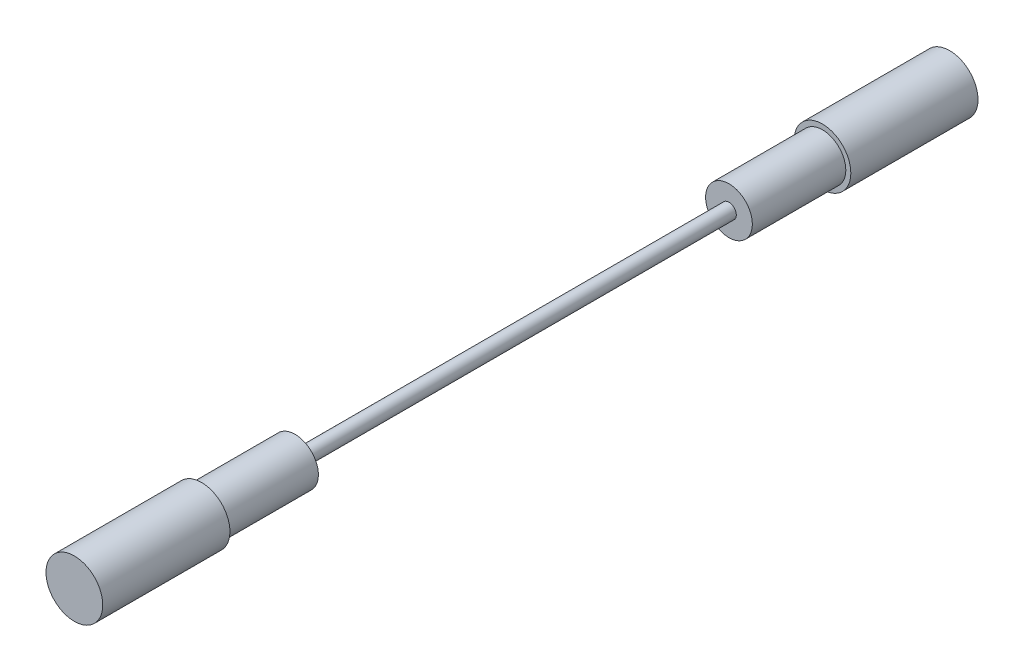
ISO-10303-21;
HEADER;
FILE_DESCRIPTION(('STEP AP214'),'2;1');
FILE_NAME('part.step','',(''),(''),'','','');
FILE_SCHEMA(('AUTOMOTIVE_DESIGN { 1 0 10303 214 1 1 1 1 }'));
ENDSEC;
DATA;
#1=APPLICATION_CONTEXT('core data for automotive mechanical design processes');
#2=APPLICATION_PROTOCOL_DEFINITION('international standard','automotive_design',2000,#1);
#3=PRODUCT_CONTEXT('',#1,'mechanical');
#4=PRODUCT('Part','Part','',(#3));
#5=PRODUCT_RELATED_PRODUCT_CATEGORY('part','',(#4));
#6=PRODUCT_DEFINITION_FORMATION('','',#4);
#7=PRODUCT_DEFINITION_CONTEXT('part definition',#1,'design');
#8=PRODUCT_DEFINITION('design','',#6,#7);
#9=PRODUCT_DEFINITION_SHAPE('','',#8);
#10=(LENGTH_UNIT() NAMED_UNIT(*) SI_UNIT(.MILLI.,.METRE.));
#11=(NAMED_UNIT(*) PLANE_ANGLE_UNIT() SI_UNIT($,.RADIAN.));
#12=(NAMED_UNIT(*) SI_UNIT($,.STERADIAN.) SOLID_ANGLE_UNIT());
#13=UNCERTAINTY_MEASURE_WITH_UNIT(LENGTH_MEASURE(1.E-05),#10,'distance_accuracy_value','');
#14=(GEOMETRIC_REPRESENTATION_CONTEXT(3) GLOBAL_UNCERTAINTY_ASSIGNED_CONTEXT((#13)) GLOBAL_UNIT_ASSIGNED_CONTEXT((#10,
#11,#12)) REPRESENTATION_CONTEXT('',''));
#15=CARTESIAN_POINT('',(0.,0.,0.));
#16=DIRECTION('',(0.,0.,1.));
#17=DIRECTION('',(1.,0.,0.));
#18=AXIS2_PLACEMENT_3D('',#15,#16,#17);
#19=CARTESIAN_POINT('',(149.433579659607,0.,306.2));
#20=DIRECTION('',(0.,0.,-1.));
#21=DIRECTION('',(0.,1.,0.));
#22=AXIS2_PLACEMENT_3D('',#19,#20,#21);
#23=PLANE('',#22);
#24=CARTESIAN_POINT('',(140.996079659607,0.,306.2));
#25=DIRECTION('',(0.,0.,-1.));
#26=DIRECTION('',(0.,1.,0.));
#27=AXIS2_PLACEMENT_3D('',#24,#25,#26);
#28=CIRCLE('',#27,8.5);
#29=CARTESIAN_POINT('',(140.996079659607,8.5,306.2));
#30=VERTEX_POINT('',#29);
#31=EDGE_CURVE('E18',#30,#30,#28,.T.);
#32=ORIENTED_EDGE('',*,*,#31,.F.);
#33=EDGE_LOOP('',(#32));
#34=FACE_BOUND('',#33,.T.);
#35=ADVANCED_FACE('F15',(#34),#23,.F.);
#36=CARTESIAN_POINT('',(140.996079659607,0.,306.2));
#37=DIRECTION('',(0.,0.,-1.));
#38=DIRECTION('',(0.,1.,0.));
#39=AXIS2_PLACEMENT_3D('',#36,#37,#38);
#40=CYLINDRICAL_SURFACE('',#39,8.5);
#41=ORIENTED_EDGE('',*,*,#31,.T.);
#42=EDGE_LOOP('',(#41));
#43=FACE_BOUND('',#42,.T.);
#44=CARTESIAN_POINT('',(140.996079659607,0.,268.1));
#45=DIRECTION('',(0.,0.,-1.));
#46=DIRECTION('',(0.,1.,0.));
#47=AXIS2_PLACEMENT_3D('',#44,#45,#46);
#48=CIRCLE('',#47,8.5);
#49=CARTESIAN_POINT('',(140.996079659607,8.49999999999999,268.1));
#50=VERTEX_POINT('',#49);
#51=EDGE_CURVE('E46',#50,#50,#48,.T.);
#52=ORIENTED_EDGE('',*,*,#51,.F.);
#53=EDGE_LOOP('',(#52));
#54=FACE_BOUND('',#53,.T.);
#55=ADVANCED_FACE('F53',(#43,#54),#40,.T.);
#56=CARTESIAN_POINT('',(149.433579659607,0.,268.1));
#57=DIRECTION('',(0.,0.,-1.));
#58=DIRECTION('',(0.,1.,0.));
#59=AXIS2_PLACEMENT_3D('',#56,#57,#58);
#60=PLANE('',#59);
#61=ORIENTED_EDGE('',*,*,#51,.T.);
#62=EDGE_LOOP('',(#61));
#63=FACE_BOUND('',#62,.T.);
#64=CARTESIAN_POINT('',(140.996079659607,0.,268.1));
#65=DIRECTION('',(0.,0.,-1.));
#66=DIRECTION('',(0.,1.,0.));
#67=AXIS2_PLACEMENT_3D('',#64,#65,#66);
#68=CIRCLE('',#67,7.);
#69=CARTESIAN_POINT('',(140.996079659607,6.99999999999999,268.1));
#70=VERTEX_POINT('',#69);
#71=EDGE_CURVE('E44',#70,#70,#68,.T.);
#72=ORIENTED_EDGE('',*,*,#71,.F.);
#73=EDGE_LOOP('',(#72));
#74=FACE_BOUND('',#73,.T.);
#75=ADVANCED_FACE('F61',(#63,#74),#60,.T.);
#76=CARTESIAN_POINT('',(140.996079659607,0.,268.1));
#77=DIRECTION('',(0.,0.,-1.));
#78=DIRECTION('',(0.,1.,0.));
#79=AXIS2_PLACEMENT_3D('',#76,#77,#78);
#80=CYLINDRICAL_SURFACE('',#79,7.);
#81=ORIENTED_EDGE('',*,*,#71,.T.);
#82=EDGE_LOOP('',(#81));
#83=FACE_BOUND('',#82,.T.);
#84=CARTESIAN_POINT('',(140.996079659607,0.,240.1));
#85=DIRECTION('',(0.,0.,-1.));
#86=DIRECTION('',(0.,1.,0.));
#87=AXIS2_PLACEMENT_3D('',#84,#85,#86);
#88=CIRCLE('',#87,7.);
#89=CARTESIAN_POINT('',(140.996079659607,6.99999999999998,240.1));
#90=VERTEX_POINT('',#89);
#91=EDGE_CURVE('E41',#90,#90,#88,.T.);
#92=ORIENTED_EDGE('',*,*,#91,.F.);
#93=EDGE_LOOP('',(#92));
#94=FACE_BOUND('',#93,.T.);
#95=ADVANCED_FACE('F92',(#83,#94),#80,.T.);
#96=CARTESIAN_POINT('',(140.996079659607,0.,240.1));
#97=DIRECTION('',(0.,0.,-1.));
#98=DIRECTION('',(0.,1.,0.));
#99=AXIS2_PLACEMENT_3D('',#96,#97,#98);
#100=PLANE('',#99);
#101=CARTESIAN_POINT('',(140.996079659607,0.,240.1));
#102=DIRECTION('',(0.,0.,1.));
#103=DIRECTION('',(1.,0.,0.));
#104=AXIS2_PLACEMENT_3D('',#101,#102,#103);
#105=CIRCLE('',#104,2.2);
#106=CARTESIAN_POINT('',(143.196079659607,0.,240.1));
#107=VERTEX_POINT('',#106);
#108=EDGE_CURVE('E38',#107,#107,#105,.F.);
#109=ORIENTED_EDGE('',*,*,#108,.F.);
#110=EDGE_LOOP('',(#109));
#111=FACE_BOUND('',#110,.T.);
#112=ORIENTED_EDGE('',*,*,#91,.T.);
#113=EDGE_LOOP('',(#112));
#114=FACE_BOUND('',#113,.T.);
#115=ADVANCED_FACE('F88',(#111,#114),#100,.T.);
#116=CARTESIAN_POINT('',(140.996079659607,0.,110.1));
#117=DIRECTION('',(0.,0.,1.));
#118=DIRECTION('',(1.,0.,0.));
#119=AXIS2_PLACEMENT_3D('',#116,#117,#118);
#120=CYLINDRICAL_SURFACE('',#119,2.2);
#121=CARTESIAN_POINT('',(140.996079659607,0.,110.1));
#122=DIRECTION('',(0.,0.,1.));
#123=DIRECTION('',(1.,0.,0.));
#124=AXIS2_PLACEMENT_3D('',#121,#122,#123);
#125=CIRCLE('',#124,2.2);
#126=CARTESIAN_POINT('',(143.196079659607,0.,110.1));
#127=VERTEX_POINT('',#126);
#128=EDGE_CURVE('E35',#127,#127,#125,.F.);
#129=ORIENTED_EDGE('',*,*,#128,.F.);
#130=EDGE_LOOP('',(#129));
#131=FACE_BOUND('',#130,.T.);
#132=ORIENTED_EDGE('',*,*,#108,.T.);
#133=EDGE_LOOP('',(#132));
#134=FACE_BOUND('',#133,.T.);
#135=ADVANCED_FACE('F84',(#131,#134),#120,.T.);
#136=CARTESIAN_POINT('',(140.996079659607,0.,110.1));
#137=DIRECTION('',(0.,0.,1.));
#138=DIRECTION('',(1.,0.,0.));
#139=AXIS2_PLACEMENT_3D('',#136,#137,#138);
#140=PLANE('',#139);
#141=ORIENTED_EDGE('',*,*,#128,.T.);
#142=EDGE_LOOP('',(#141));
#143=FACE_BOUND('',#142,.T.);
#144=CARTESIAN_POINT('',(140.996079659607,0.,110.1));
#145=DIRECTION('',(0.,0.,1.));
#146=DIRECTION('',(1.,0.,0.));
#147=AXIS2_PLACEMENT_3D('',#144,#145,#146);
#148=CIRCLE('',#147,7.);
#149=CARTESIAN_POINT('',(147.996079659607,0.,110.1));
#150=VERTEX_POINT('',#149);
#151=EDGE_CURVE('E32',#150,#150,#148,.F.);
#152=ORIENTED_EDGE('',*,*,#151,.F.);
#153=EDGE_LOOP('',(#152));
#154=FACE_BOUND('',#153,.T.);
#155=ADVANCED_FACE('F80',(#143,#154),#140,.T.);
#156=CARTESIAN_POINT('',(140.996079659607,0.,82.1));
#157=DIRECTION('',(0.,0.,1.));
#158=DIRECTION('',(1.,0.,0.));
#159=AXIS2_PLACEMENT_3D('',#156,#157,#158);
#160=CYLINDRICAL_SURFACE('',#159,7.);
#161=CARTESIAN_POINT('',(140.996079659607,0.,82.1));
#162=DIRECTION('',(0.,0.,1.));
#163=DIRECTION('',(1.,0.,0.));
#164=AXIS2_PLACEMENT_3D('',#161,#162,#163);
#165=CIRCLE('',#164,7.);
#166=CARTESIAN_POINT('',(147.996079659607,0.,82.1));
#167=VERTEX_POINT('',#166);
#168=EDGE_CURVE('E27',#167,#167,#165,.F.);
#169=ORIENTED_EDGE('',*,*,#168,.F.);
#170=EDGE_LOOP('',(#169));
#171=FACE_BOUND('',#170,.T.);
#172=ORIENTED_EDGE('',*,*,#151,.T.);
#173=EDGE_LOOP('',(#172));
#174=FACE_BOUND('',#173,.T.);
#175=ADVANCED_FACE('F76',(#171,#174),#160,.T.);
#176=CARTESIAN_POINT('',(149.433579659607,0.,82.1));
#177=DIRECTION('',(0.,0.,1.));
#178=DIRECTION('',(1.,0.,0.));
#179=AXIS2_PLACEMENT_3D('',#176,#177,#178);
#180=PLANE('',#179);
#181=CARTESIAN_POINT('',(140.996079659607,0.,82.1));
#182=DIRECTION('',(0.,0.,1.));
#183=DIRECTION('',(1.,0.,0.));
#184=AXIS2_PLACEMENT_3D('',#181,#182,#183);
#185=CIRCLE('',#184,8.5);
#186=CARTESIAN_POINT('',(149.496079659607,0.,82.1));
#187=VERTEX_POINT('',#186);
#188=EDGE_CURVE('E22',#187,#187,#185,.F.);
#189=ORIENTED_EDGE('',*,*,#188,.F.);
#190=EDGE_LOOP('',(#189));
#191=FACE_BOUND('',#190,.T.);
#192=ORIENTED_EDGE('',*,*,#168,.T.);
#193=EDGE_LOOP('',(#192));
#194=FACE_BOUND('',#193,.T.);
#195=ADVANCED_FACE('F69',(#191,#194),#180,.T.);
#196=CARTESIAN_POINT('',(149.433579659607,0.,44.));
#197=DIRECTION('',(0.,0.,1.));
#198=DIRECTION('',(1.,0.,0.));
#199=AXIS2_PLACEMENT_3D('',#196,#197,#198);
#200=PLANE('',#199);
#201=CARTESIAN_POINT('',(140.996079659607,0.,44.));
#202=DIRECTION('',(0.,0.,1.));
#203=DIRECTION('',(1.,0.,0.));
#204=AXIS2_PLACEMENT_3D('',#201,#202,#203);
#205=CIRCLE('',#204,8.5);
#206=CARTESIAN_POINT('',(149.496079659607,0.,44.));
#207=VERTEX_POINT('',#206);
#208=EDGE_CURVE('E10',#207,#207,#205,.T.);
#209=ORIENTED_EDGE('',*,*,#208,.F.);
#210=EDGE_LOOP('',(#209));
#211=FACE_BOUND('',#210,.T.);
#212=ADVANCED_FACE('F64',(#211),#200,.F.);
#213=CARTESIAN_POINT('',(140.996079659607,0.,44.));
#214=DIRECTION('',(0.,0.,1.));
#215=DIRECTION('',(1.,0.,0.));
#216=AXIS2_PLACEMENT_3D('',#213,#214,#215);
#217=CYLINDRICAL_SURFACE('',#216,8.5);
#218=ORIENTED_EDGE('',*,*,#208,.T.);
#219=EDGE_LOOP('',(#218));
#220=FACE_BOUND('',#219,.T.);
#221=ORIENTED_EDGE('',*,*,#188,.T.);
#222=EDGE_LOOP('',(#221));
#223=FACE_BOUND('',#222,.T.);
#224=ADVANCED_FACE('F62',(#220,#223),#217,.T.);
#225=CLOSED_SHELL('',(#35,#55,#75,#95,#115,#135,#155,#175,#195,#212,#224));
#226=MANIFOLD_SOLID_BREP('B1',#225);
#227=ADVANCED_BREP_SHAPE_REPRESENTATION('',(#18,#226),#14);
#228=SHAPE_DEFINITION_REPRESENTATION(#9,#227);
ENDSEC;
END-ISO-10303-21;
